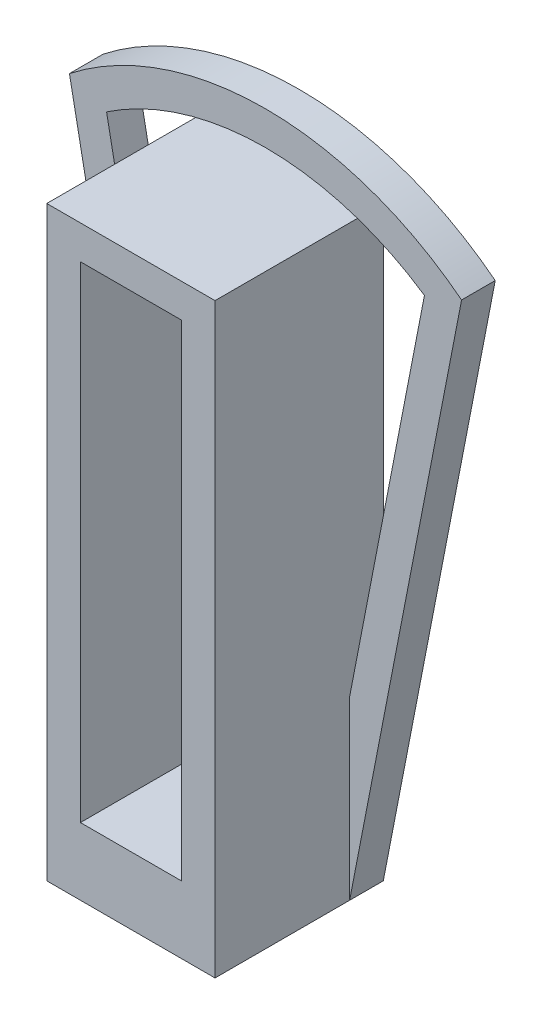
ISO-10303-21;
HEADER;
FILE_DESCRIPTION(('STEP AP214'),'2;1');
FILE_NAME('part.step','',(''),(''),'','','');
FILE_SCHEMA(('AUTOMOTIVE_DESIGN { 1 0 10303 214 1 1 1 1 }'));
ENDSEC;
DATA;
#1=APPLICATION_CONTEXT('core data for automotive mechanical design processes');
#2=APPLICATION_PROTOCOL_DEFINITION('international standard','automotive_design',2000,#1);
#3=PRODUCT_CONTEXT('',#1,'mechanical');
#4=PRODUCT('Part','Part','',(#3));
#5=PRODUCT_RELATED_PRODUCT_CATEGORY('part','',(#4));
#6=PRODUCT_DEFINITION_FORMATION('','',#4);
#7=PRODUCT_DEFINITION_CONTEXT('part definition',#1,'design');
#8=PRODUCT_DEFINITION('design','',#6,#7);
#9=PRODUCT_DEFINITION_SHAPE('','',#8);
#10=(LENGTH_UNIT() NAMED_UNIT(*) SI_UNIT(.MILLI.,.METRE.));
#11=(NAMED_UNIT(*) PLANE_ANGLE_UNIT() SI_UNIT($,.RADIAN.));
#12=(NAMED_UNIT(*) SI_UNIT($,.STERADIAN.) SOLID_ANGLE_UNIT());
#13=UNCERTAINTY_MEASURE_WITH_UNIT(LENGTH_MEASURE(1.E-05),#10,'distance_accuracy_value','');
#14=(GEOMETRIC_REPRESENTATION_CONTEXT(3) GLOBAL_UNCERTAINTY_ASSIGNED_CONTEXT((#13)) GLOBAL_UNIT_ASSIGNED_CONTEXT((#10,
#11,#12)) REPRESENTATION_CONTEXT('',''));
#15=CARTESIAN_POINT('',(0.,0.,0.));
#16=DIRECTION('',(0.,0.,1.));
#17=DIRECTION('',(1.,0.,0.));
#18=AXIS2_PLACEMENT_3D('',#15,#16,#17);
#19=CARTESIAN_POINT('',(0.,0.,1.));
#20=DIRECTION('',(0.,0.,-1.));
#21=DIRECTION('',(-1.,0.,0.));
#22=AXIS2_PLACEMENT_3D('',#19,#20,#21);
#23=PLANE('',#22);
#24=DIRECTION('',(0.,-1.,0.));
#25=VECTOR('',#24,1.);
#26=CARTESIAN_POINT('',(-0.5,-1.7,1.));
#27=LINE('',#26,#25);
#28=CARTESIAN_POINT('',(-0.5,1.78641679103579,1.));
#29=VERTEX_POINT('',#28);
#30=CARTESIAN_POINT('',(-0.5,-1.7,1.));
#31=VERTEX_POINT('',#30);
#32=EDGE_CURVE('E165',#29,#31,#27,.T.);
#33=ORIENTED_EDGE('',*,*,#32,.T.);
#34=DIRECTION('',(1.,0.,0.));
#35=VECTOR('',#34,1.);
#36=CARTESIAN_POINT('',(-0.5,-1.7,1.));
#37=LINE('',#36,#35);
#38=CARTESIAN_POINT('',(0.5,-1.7,1.));
#39=VERTEX_POINT('',#38);
#40=EDGE_CURVE('E169',#31,#39,#37,.T.);
#41=ORIENTED_EDGE('',*,*,#40,.T.);
#42=DIRECTION('',(0.,1.,0.));
#43=VECTOR('',#42,1.);
#44=CARTESIAN_POINT('',(0.5,-1.7,1.));
#45=LINE('',#44,#43);
#46=CARTESIAN_POINT('',(0.5,1.78641679103579,1.));
#47=VERTEX_POINT('',#46);
#48=EDGE_CURVE('E173',#39,#47,#45,.T.);
#49=ORIENTED_EDGE('',*,*,#48,.T.);
#50=DIRECTION('',(-1.,0.,0.));
#51=VECTOR('',#50,1.);
#52=CARTESIAN_POINT('',(-0.5,1.78641679103579,1.));
#53=LINE('',#52,#51);
#54=EDGE_CURVE('E176',#47,#29,#53,.T.);
#55=ORIENTED_EDGE('',*,*,#54,.T.);
#56=EDGE_LOOP('',(#33,#41,#49,#55));
#57=FACE_BOUND('',#56,.T.);
#58=DIRECTION('',(0.,-1.,0.));
#59=VECTOR('',#58,1.);
#60=CARTESIAN_POINT('',(-0.3,1.58641679103579,1.));
#61=LINE('',#60,#59);
#62=CARTESIAN_POINT('',(-0.3,1.58641679103579,1.));
#63=VERTEX_POINT('',#62);
#64=CARTESIAN_POINT('',(-0.3,-1.3,1.));
#65=VERTEX_POINT('',#64);
#66=EDGE_CURVE('E117',#63,#65,#61,.T.);
#67=ORIENTED_EDGE('',*,*,#66,.F.);
#68=DIRECTION('',(-1.,0.,0.));
#69=VECTOR('',#68,1.);
#70=CARTESIAN_POINT('',(-0.3,1.58641679103579,1.));
#71=LINE('',#70,#69);
#72=CARTESIAN_POINT('',(0.3,1.58641679103579,1.));
#73=VERTEX_POINT('',#72);
#74=EDGE_CURVE('E143',#73,#63,#71,.T.);
#75=ORIENTED_EDGE('',*,*,#74,.F.);
#76=DIRECTION('',(0.,1.,0.));
#77=VECTOR('',#76,1.);
#78=CARTESIAN_POINT('',(0.3,1.58641679103579,1.));
#79=LINE('',#78,#77);
#80=CARTESIAN_POINT('',(0.3,-1.3,1.));
#81=VERTEX_POINT('',#80);
#82=EDGE_CURVE('E139',#81,#73,#79,.T.);
#83=ORIENTED_EDGE('',*,*,#82,.F.);
#84=DIRECTION('',(1.,0.,0.));
#85=VECTOR('',#84,1.);
#86=CARTESIAN_POINT('',(-0.3,-1.3,1.));
#87=LINE('',#86,#85);
#88=EDGE_CURVE('E126',#65,#81,#87,.T.);
#89=ORIENTED_EDGE('',*,*,#88,.F.);
#90=EDGE_LOOP('',(#67,#75,#83,#89));
#91=FACE_BOUND('',#90,.T.);
#92=ADVANCED_FACE('F51',(#57,#91),#23,.F.);
#93=CARTESIAN_POINT('',(0.,0.,0.));
#94=DIRECTION('',(0.,0.,-1.));
#95=DIRECTION('',(-1.,0.,0.));
#96=AXIS2_PLACEMENT_3D('',#93,#94,#95);
#97=PLANE('',#96);
#98=DIRECTION('',(0.,-1.,0.));
#99=VECTOR('',#98,1.);
#100=CARTESIAN_POINT('',(-0.5,-1.7,0.));
#101=LINE('',#100,#99);
#102=CARTESIAN_POINT('',(-0.5,1.78641679103579,0.));
#103=VERTEX_POINT('',#102);
#104=CARTESIAN_POINT('',(-0.5,-1.7,0.));
#105=VERTEX_POINT('',#104);
#106=EDGE_CURVE('E135',#103,#105,#101,.T.);
#107=ORIENTED_EDGE('',*,*,#106,.F.);
#108=DIRECTION('',(-1.,0.,0.));
#109=VECTOR('',#108,1.);
#110=CARTESIAN_POINT('',(-0.5,1.78641679103579,0.));
#111=LINE('',#110,#109);
#112=CARTESIAN_POINT('',(0.5,1.78641679103579,0.));
#113=VERTEX_POINT('',#112);
#114=EDGE_CURVE('E170',#113,#103,#111,.T.);
#115=ORIENTED_EDGE('',*,*,#114,.F.);
#116=DIRECTION('',(0.,1.,0.));
#117=VECTOR('',#116,1.);
#118=CARTESIAN_POINT('',(0.5,-1.7,0.));
#119=LINE('',#118,#117);
#120=CARTESIAN_POINT('',(0.5,-1.7,0.));
#121=VERTEX_POINT('',#120);
#122=EDGE_CURVE('E186',#121,#113,#119,.T.);
#123=ORIENTED_EDGE('',*,*,#122,.F.);
#124=DIRECTION('',(1.,0.,0.));
#125=VECTOR('',#124,1.);
#126=CARTESIAN_POINT('',(-0.5,-1.7,0.));
#127=LINE('',#126,#125);
#128=EDGE_CURVE('E183',#105,#121,#127,.T.);
#129=ORIENTED_EDGE('',*,*,#128,.F.);
#130=EDGE_LOOP('',(#107,#115,#123,#129));
#131=FACE_BOUND('',#130,.T.);
#132=DIRECTION('',(-1.,0.,0.));
#133=VECTOR('',#132,1.);
#134=CARTESIAN_POINT('',(-0.3,1.58641679103579,0.));
#135=LINE('',#134,#133);
#136=CARTESIAN_POINT('',(0.3,1.58641679103579,0.));
#137=VERTEX_POINT('',#136);
#138=CARTESIAN_POINT('',(-0.3,1.58641679103579,0.));
#139=VERTEX_POINT('',#138);
#140=EDGE_CURVE('E127',#137,#139,#135,.T.);
#141=ORIENTED_EDGE('',*,*,#140,.T.);
#142=DIRECTION('',(0.,-1.,0.));
#143=VECTOR('',#142,1.);
#144=CARTESIAN_POINT('',(-0.3,1.58641679103579,0.));
#145=LINE('',#144,#143);
#146=CARTESIAN_POINT('',(-0.3,-1.3,0.));
#147=VERTEX_POINT('',#146);
#148=EDGE_CURVE('E75',#139,#147,#145,.T.);
#149=ORIENTED_EDGE('',*,*,#148,.T.);
#150=DIRECTION('',(1.,0.,0.));
#151=VECTOR('',#150,1.);
#152=CARTESIAN_POINT('',(-0.3,-1.3,0.));
#153=LINE('',#152,#151);
#154=CARTESIAN_POINT('',(0.3,-1.3,0.));
#155=VERTEX_POINT('',#154);
#156=EDGE_CURVE('E133',#147,#155,#153,.T.);
#157=ORIENTED_EDGE('',*,*,#156,.T.);
#158=DIRECTION('',(0.,1.,0.));
#159=VECTOR('',#158,1.);
#160=CARTESIAN_POINT('',(0.3,1.58641679103579,0.));
#161=LINE('',#160,#159);
#162=EDGE_CURVE('E152',#155,#137,#161,.T.);
#163=ORIENTED_EDGE('',*,*,#162,.T.);
#164=EDGE_LOOP('',(#141,#149,#157,#163));
#165=FACE_BOUND('',#164,.T.);
#166=ADVANCED_FACE('F209',(#131,#165),#97,.T.);
#167=CARTESIAN_POINT('',(-0.5,-1.7,1.));
#168=DIRECTION('',(1.,0.,0.));
#169=DIRECTION('',(0.,0.,-1.));
#170=AXIS2_PLACEMENT_3D('',#167,#168,#169);
#171=PLANE('',#170);
#172=ORIENTED_EDGE('',*,*,#106,.T.);
#173=DIRECTION('',(0.,0.,-1.));
#174=VECTOR('',#173,1.);
#175=CARTESIAN_POINT('',(-0.5,-1.7,1.));
#176=LINE('',#175,#174);
#177=EDGE_CURVE('E12',#31,#105,#176,.T.);
#178=ORIENTED_EDGE('',*,*,#177,.F.);
#179=ORIENTED_EDGE('',*,*,#32,.F.);
#180=DIRECTION('',(0.,0.,-1.));
#181=VECTOR('',#180,1.);
#182=CARTESIAN_POINT('',(-0.5,1.78641679103579,1.));
#183=LINE('',#182,#181);
#184=EDGE_CURVE('E179',#29,#103,#183,.T.);
#185=ORIENTED_EDGE('',*,*,#184,.T.);
#186=EDGE_LOOP('',(#172,#178,#179,#185));
#187=FACE_BOUND('',#186,.T.);
#188=ADVANCED_FACE('F53',(#187),#171,.F.);
#189=CARTESIAN_POINT('',(-0.5,-1.7,1.));
#190=DIRECTION('',(0.,1.,0.));
#191=DIRECTION('',(0.,0.,1.));
#192=AXIS2_PLACEMENT_3D('',#189,#190,#191);
#193=PLANE('',#192);
#194=ORIENTED_EDGE('',*,*,#128,.T.);
#195=DIRECTION('',(0.,0.,-1.));
#196=VECTOR('',#195,1.);
#197=CARTESIAN_POINT('',(0.5,-1.7,1.));
#198=LINE('',#197,#196);
#199=EDGE_CURVE('E60',#39,#121,#198,.T.);
#200=ORIENTED_EDGE('',*,*,#199,.F.);
#201=ORIENTED_EDGE('',*,*,#40,.F.);
#202=ORIENTED_EDGE('',*,*,#177,.T.);
#203=EDGE_LOOP('',(#194,#200,#201,#202));
#204=FACE_BOUND('',#203,.T.);
#205=ADVANCED_FACE('F219',(#204),#193,.F.);
#206=CARTESIAN_POINT('',(0.5,-1.7,1.));
#207=DIRECTION('',(-1.,0.,0.));
#208=DIRECTION('',(0.,0.,1.));
#209=AXIS2_PLACEMENT_3D('',#206,#207,#208);
#210=PLANE('',#209);
#211=ORIENTED_EDGE('',*,*,#122,.T.);
#212=DIRECTION('',(0.,0.,-1.));
#213=VECTOR('',#212,1.);
#214=CARTESIAN_POINT('',(0.5,1.78641679103579,1.));
#215=LINE('',#214,#213);
#216=EDGE_CURVE('E194',#47,#113,#215,.T.);
#217=ORIENTED_EDGE('',*,*,#216,.F.);
#218=ORIENTED_EDGE('',*,*,#48,.F.);
#219=ORIENTED_EDGE('',*,*,#199,.T.);
#220=EDGE_LOOP('',(#211,#217,#218,#219));
#221=FACE_BOUND('',#220,.T.);
#222=ADVANCED_FACE('F203',(#221),#210,.F.);
#223=CARTESIAN_POINT('',(-0.5,1.78641679103579,1.));
#224=DIRECTION('',(0.,-1.,0.));
#225=DIRECTION('',(0.,0.,-1.));
#226=AXIS2_PLACEMENT_3D('',#223,#224,#225);
#227=PLANE('',#226);
#228=ORIENTED_EDGE('',*,*,#114,.T.);
#229=ORIENTED_EDGE('',*,*,#184,.F.);
#230=ORIENTED_EDGE('',*,*,#54,.F.);
#231=ORIENTED_EDGE('',*,*,#216,.T.);
#232=EDGE_LOOP('',(#228,#229,#230,#231));
#233=FACE_BOUND('',#232,.T.);
#234=ADVANCED_FACE('F213',(#233),#227,.F.);
#235=CARTESIAN_POINT('',(-0.3,1.58641679103579,1.));
#236=DIRECTION('',(1.,0.,0.));
#237=DIRECTION('',(0.,1.,0.));
#238=AXIS2_PLACEMENT_3D('',#235,#236,#237);
#239=PLANE('',#238);
#240=ORIENTED_EDGE('',*,*,#148,.F.);
#241=DIRECTION('',(0.,0.,-1.));
#242=VECTOR('',#241,1.);
#243=CARTESIAN_POINT('',(-0.3,1.58641679103579,1.));
#244=LINE('',#243,#242);
#245=EDGE_CURVE('E121',#63,#139,#244,.T.);
#246=ORIENTED_EDGE('',*,*,#245,.F.);
#247=ORIENTED_EDGE('',*,*,#66,.T.);
#248=DIRECTION('',(0.,0.,-1.));
#249=VECTOR('',#248,1.);
#250=CARTESIAN_POINT('',(-0.3,-1.3,1.));
#251=LINE('',#250,#249);
#252=EDGE_CURVE('E120',#65,#147,#251,.T.);
#253=ORIENTED_EDGE('',*,*,#252,.T.);
#254=EDGE_LOOP('',(#240,#246,#247,#253));
#255=FACE_BOUND('',#254,.T.);
#256=ADVANCED_FACE('F119',(#255),#239,.T.);
#257=CARTESIAN_POINT('',(-0.3,-1.3,1.));
#258=DIRECTION('',(0.,1.,0.));
#259=DIRECTION('',(0.,0.,1.));
#260=AXIS2_PLACEMENT_3D('',#257,#258,#259);
#261=PLANE('',#260);
#262=ORIENTED_EDGE('',*,*,#156,.F.);
#263=ORIENTED_EDGE('',*,*,#252,.F.);
#264=ORIENTED_EDGE('',*,*,#88,.T.);
#265=DIRECTION('',(0.,0.,-1.));
#266=VECTOR('',#265,1.);
#267=CARTESIAN_POINT('',(0.3,-1.3,1.));
#268=LINE('',#267,#266);
#269=EDGE_CURVE('E136',#81,#155,#268,.T.);
#270=ORIENTED_EDGE('',*,*,#269,.T.);
#271=EDGE_LOOP('',(#262,#263,#264,#270));
#272=FACE_BOUND('',#271,.T.);
#273=ADVANCED_FACE('F130',(#272),#261,.T.);
#274=CARTESIAN_POINT('',(0.3,1.58641679103579,1.));
#275=DIRECTION('',(-1.,0.,0.));
#276=DIRECTION('',(0.,-1.,0.));
#277=AXIS2_PLACEMENT_3D('',#274,#275,#276);
#278=PLANE('',#277);
#279=ORIENTED_EDGE('',*,*,#162,.F.);
#280=ORIENTED_EDGE('',*,*,#269,.F.);
#281=ORIENTED_EDGE('',*,*,#82,.T.);
#282=DIRECTION('',(0.,0.,-1.));
#283=VECTOR('',#282,1.);
#284=CARTESIAN_POINT('',(0.3,1.58641679103579,1.));
#285=LINE('',#284,#283);
#286=EDGE_CURVE('E67',#73,#137,#285,.T.);
#287=ORIENTED_EDGE('',*,*,#286,.T.);
#288=EDGE_LOOP('',(#279,#280,#281,#287));
#289=FACE_BOUND('',#288,.T.);
#290=ADVANCED_FACE('F242',(#289),#278,.T.);
#291=CARTESIAN_POINT('',(-0.3,1.58641679103579,1.));
#292=DIRECTION('',(0.,-1.,0.));
#293=DIRECTION('',(0.,0.,-1.));
#294=AXIS2_PLACEMENT_3D('',#291,#292,#293);
#295=PLANE('',#294);
#296=ORIENTED_EDGE('',*,*,#140,.F.);
#297=ORIENTED_EDGE('',*,*,#286,.F.);
#298=ORIENTED_EDGE('',*,*,#74,.T.);
#299=ORIENTED_EDGE('',*,*,#245,.T.);
#300=EDGE_LOOP('',(#296,#297,#298,#299));
#301=FACE_BOUND('',#300,.T.);
#302=ADVANCED_FACE('F246',(#301),#295,.T.);
#303=CLOSED_SHELL('',(#92,#166,#188,#205,#222,#234,#256,#273,#290,#302));
#304=MANIFOLD_SOLID_BREP('B2',#303);
#305=CARTESIAN_POINT('',(0.,0.232796998725857,0.2));
#306=DIRECTION('',(0.,0.,-1.));
#307=DIRECTION('',(-1.,0.,0.));
#308=AXIS2_PLACEMENT_3D('',#305,#306,#307);
#309=PLANE('',#308);
#310=DIRECTION('',(0.190808995376545,0.981627183447664,0.));
#311=VECTOR('',#310,1.);
#312=CARTESIAN_POINT('',(0.335132722836501,-1.5,0.2));
#313=LINE('',#312,#311);
#314=CARTESIAN_POINT('',(0.374008784664045,-1.3,0.2));
#315=VERTEX_POINT('',#314);
#316=CARTESIAN_POINT('',(0.944627099087957,1.63557674105574,0.2));
#317=VERTEX_POINT('',#316);
#318=EDGE_CURVE('E388',#315,#317,#313,.T.);
#319=ORIENTED_EDGE('',*,*,#318,.F.);
#320=DIRECTION('',(-1.,0.,0.));
#321=VECTOR('',#320,1.);
#322=CARTESIAN_POINT('',(-0.374008784664045,-1.3,0.2));
#323=LINE('',#322,#321);
#324=CARTESIAN_POINT('',(-0.374008784664045,-1.3,0.2));
#325=VERTEX_POINT('',#324);
#326=EDGE_CURVE('E384',#315,#325,#323,.T.);
#327=ORIENTED_EDGE('',*,*,#326,.T.);
#328=DIRECTION('',(0.190808995376546,-0.981627183447664,0.));
#329=VECTOR('',#328,1.);
#330=CARTESIAN_POINT('',(-0.335132722836501,-1.5,0.2));
#331=LINE('',#330,#329);
#332=CARTESIAN_POINT('',(-0.944627099087958,1.63557674105574,0.2));
#333=VERTEX_POINT('',#332);
#334=EDGE_CURVE('E367',#333,#325,#331,.T.);
#335=ORIENTED_EDGE('',*,*,#334,.F.);
#336=CARTESIAN_POINT('',(0.,0.232796998725857,0.2));
#337=DIRECTION('',(0.,0.,1.));
#338=DIRECTION('',(-1.,0.,0.));
#339=AXIS2_PLACEMENT_3D('',#336,#337,#338);
#340=CIRCLE('',#339,1.6911863770213);
#341=EDGE_CURVE('E378',#317,#333,#340,.T.);
#342=ORIENTED_EDGE('',*,*,#341,.F.);
#343=EDGE_LOOP('',(#319,#327,#335,#342));
#344=FACE_BOUND('',#343,.T.);
#345=DIRECTION('',(1.,0.,0.));
#346=VECTOR('',#345,1.);
#347=CARTESIAN_POINT('',(-0.5,-1.7,0.2));
#348=LINE('',#347,#346);
#349=CARTESIAN_POINT('',(-0.5,-1.7,0.2));
#350=VERTEX_POINT('',#349);
#351=CARTESIAN_POINT('',(0.5,-1.7,0.2));
#352=VERTEX_POINT('',#351);
#353=EDGE_CURVE('E405',#350,#352,#348,.T.);
#354=ORIENTED_EDGE('',*,*,#353,.T.);
#355=DIRECTION('',(0.190808995376545,0.981627183447664,0.));
#356=VECTOR('',#355,1.);
#357=CARTESIAN_POINT('',(0.5,-1.7,0.2));
#358=LINE('',#357,#356);
#359=CARTESIAN_POINT('',(1.16523968536146,1.72236149490911,0.2));
#360=VERTEX_POINT('',#359);
#361=EDGE_CURVE('E408',#352,#360,#358,.T.);
#362=ORIENTED_EDGE('',*,*,#361,.T.);
#363=CARTESIAN_POINT('',(0.,0.232796998725857,0.2));
#364=DIRECTION('',(0.,0.,1.));
#365=DIRECTION('',(-1.,0.,0.));
#366=AXIS2_PLACEMENT_3D('',#363,#364,#365);
#367=CIRCLE('',#366,1.8911863770213);
#368=CARTESIAN_POINT('',(-1.16523968536146,1.72236149490911,0.2));
#369=VERTEX_POINT('',#368);
#370=EDGE_CURVE('E411',#360,#369,#367,.T.);
#371=ORIENTED_EDGE('',*,*,#370,.T.);
#372=DIRECTION('',(0.190808995376545,-0.981627183447664,0.));
#373=VECTOR('',#372,1.);
#374=CARTESIAN_POINT('',(-0.5,-1.7,0.2));
#375=LINE('',#374,#373);
#376=EDGE_CURVE('E413',#369,#350,#375,.T.);
#377=ORIENTED_EDGE('',*,*,#376,.T.);
#378=EDGE_LOOP('',(#354,#362,#371,#377));
#379=FACE_BOUND('',#378,.T.);
#380=ADVANCED_FACE('F304',(#344,#379),#309,.F.);
#381=CARTESIAN_POINT('',(0.,0.232796998725857,0.));
#382=DIRECTION('',(0.,0.,-1.));
#383=DIRECTION('',(-1.,0.,0.));
#384=AXIS2_PLACEMENT_3D('',#381,#382,#383);
#385=PLANE('',#384);
#386=DIRECTION('',(-1.,0.,0.));
#387=VECTOR('',#386,1.);
#388=CARTESIAN_POINT('',(-0.374008784664045,-1.3,0.));
#389=LINE('',#388,#387);
#390=CARTESIAN_POINT('',(0.374008784664045,-1.3,0.));
#391=VERTEX_POINT('',#390);
#392=CARTESIAN_POINT('',(-0.374008784664045,-1.3,0.));
#393=VERTEX_POINT('',#392);
#394=EDGE_CURVE('E385',#391,#393,#389,.T.);
#395=ORIENTED_EDGE('',*,*,#394,.F.);
#396=DIRECTION('',(0.190808995376545,0.981627183447664,0.));
#397=VECTOR('',#396,1.);
#398=CARTESIAN_POINT('',(0.335132722836501,-1.5,0.));
#399=LINE('',#398,#397);
#400=CARTESIAN_POINT('',(0.944627099087957,1.63557674105574,0.));
#401=VERTEX_POINT('',#400);
#402=EDGE_CURVE('E324',#391,#401,#399,.T.);
#403=ORIENTED_EDGE('',*,*,#402,.T.);
#404=CARTESIAN_POINT('',(0.,0.232796998725857,0.));
#405=DIRECTION('',(0.,0.,1.));
#406=DIRECTION('',(-1.,0.,0.));
#407=AXIS2_PLACEMENT_3D('',#404,#405,#406);
#408=CIRCLE('',#407,1.6911863770213);
#409=CARTESIAN_POINT('',(-0.944627099087958,1.63557674105574,0.));
#410=VERTEX_POINT('',#409);
#411=EDGE_CURVE('E397',#401,#410,#408,.T.);
#412=ORIENTED_EDGE('',*,*,#411,.T.);
#413=DIRECTION('',(0.190808995376546,-0.981627183447664,0.));
#414=VECTOR('',#413,1.);
#415=CARTESIAN_POINT('',(-0.335132722836501,-1.5,0.));
#416=LINE('',#415,#414);
#417=EDGE_CURVE('E394',#410,#393,#416,.T.);
#418=ORIENTED_EDGE('',*,*,#417,.T.);
#419=EDGE_LOOP('',(#395,#403,#412,#418));
#420=FACE_BOUND('',#419,.T.);
#421=DIRECTION('',(1.,0.,0.));
#422=VECTOR('',#421,1.);
#423=CARTESIAN_POINT('',(-0.5,-1.7,0.));
#424=LINE('',#423,#422);
#425=CARTESIAN_POINT('',(-0.5,-1.7,0.));
#426=VERTEX_POINT('',#425);
#427=CARTESIAN_POINT('',(0.5,-1.7,0.));
#428=VERTEX_POINT('',#427);
#429=EDGE_CURVE('E404',#426,#428,#424,.T.);
#430=ORIENTED_EDGE('',*,*,#429,.F.);
#431=DIRECTION('',(0.190808995376545,-0.981627183447664,0.));
#432=VECTOR('',#431,1.);
#433=CARTESIAN_POINT('',(-0.5,-1.7,0.));
#434=LINE('',#433,#432);
#435=CARTESIAN_POINT('',(-1.16523968536146,1.72236149490911,0.));
#436=VERTEX_POINT('',#435);
#437=EDGE_CURVE('E409',#436,#426,#434,.T.);
#438=ORIENTED_EDGE('',*,*,#437,.F.);
#439=CARTESIAN_POINT('',(0.,0.232796998725857,0.));
#440=DIRECTION('',(0.,0.,1.));
#441=DIRECTION('',(-1.,0.,0.));
#442=AXIS2_PLACEMENT_3D('',#439,#440,#441);
#443=CIRCLE('',#442,1.8911863770213);
#444=CARTESIAN_POINT('',(1.16523968536146,1.72236149490911,0.));
#445=VERTEX_POINT('',#444);
#446=EDGE_CURVE('E420',#445,#436,#443,.T.);
#447=ORIENTED_EDGE('',*,*,#446,.F.);
#448=DIRECTION('',(0.190808995376545,0.981627183447664,0.));
#449=VECTOR('',#448,1.);
#450=CARTESIAN_POINT('',(0.5,-1.7,0.));
#451=LINE('',#450,#449);
#452=EDGE_CURVE('E418',#428,#445,#451,.T.);
#453=ORIENTED_EDGE('',*,*,#452,.F.);
#454=EDGE_LOOP('',(#430,#438,#447,#453));
#455=FACE_BOUND('',#454,.T.);
#456=ADVANCED_FACE('F438',(#420,#455),#385,.T.);
#457=CARTESIAN_POINT('',(-0.5,-1.7,0.2));
#458=DIRECTION('',(0.,1.,0.));
#459=DIRECTION('',(0.,0.,1.));
#460=AXIS2_PLACEMENT_3D('',#457,#458,#459);
#461=PLANE('',#460);
#462=ORIENTED_EDGE('',*,*,#429,.T.);
#463=DIRECTION('',(0.,0.,-1.));
#464=VECTOR('',#463,1.);
#465=CARTESIAN_POINT('',(0.5,-1.7,0.2));
#466=LINE('',#465,#464);
#467=EDGE_CURVE('E49',#352,#428,#466,.T.);
#468=ORIENTED_EDGE('',*,*,#467,.F.);
#469=ORIENTED_EDGE('',*,*,#353,.F.);
#470=DIRECTION('',(0.,0.,-1.));
#471=VECTOR('',#470,1.);
#472=CARTESIAN_POINT('',(-0.5,-1.7,0.2));
#473=LINE('',#472,#471);
#474=EDGE_CURVE('E415',#350,#426,#473,.T.);
#475=ORIENTED_EDGE('',*,*,#474,.T.);
#476=EDGE_LOOP('',(#462,#468,#469,#475));
#477=FACE_BOUND('',#476,.T.);
#478=ADVANCED_FACE('F306',(#477),#461,.F.);
#479=CARTESIAN_POINT('',(0.5,-1.7,0.2));
#480=DIRECTION('',(-0.981627183447664,0.190808995376545,0.));
#481=DIRECTION('',(-0.190808995376545,-0.981627183447664,0.));
#482=AXIS2_PLACEMENT_3D('',#479,#480,#481);
#483=PLANE('',#482);
#484=ORIENTED_EDGE('',*,*,#452,.T.);
#485=DIRECTION('',(0.,0.,-1.));
#486=VECTOR('',#485,1.);
#487=CARTESIAN_POINT('',(1.16523968536146,1.72236149490911,0.2));
#488=LINE('',#487,#486);
#489=EDGE_CURVE('E312',#360,#445,#488,.T.);
#490=ORIENTED_EDGE('',*,*,#489,.F.);
#491=ORIENTED_EDGE('',*,*,#361,.F.);
#492=ORIENTED_EDGE('',*,*,#467,.T.);
#493=EDGE_LOOP('',(#484,#490,#491,#492));
#494=FACE_BOUND('',#493,.T.);
#495=ADVANCED_FACE('F446',(#494),#483,.F.);
#496=CARTESIAN_POINT('',(0.,0.232796998725857,0.2));
#497=DIRECTION('',(0.,0.,-1.));
#498=DIRECTION('',(-1.,0.,0.));
#499=AXIS2_PLACEMENT_3D('',#496,#497,#498);
#500=CYLINDRICAL_SURFACE('',#499,1.8911863770213);
#501=ORIENTED_EDGE('',*,*,#446,.T.);
#502=DIRECTION('',(0.,0.,-1.));
#503=VECTOR('',#502,1.);
#504=CARTESIAN_POINT('',(-1.16523968536146,1.72236149490911,0.2));
#505=LINE('',#504,#503);
#506=EDGE_CURVE('E425',#369,#436,#505,.T.);
#507=ORIENTED_EDGE('',*,*,#506,.F.);
#508=ORIENTED_EDGE('',*,*,#370,.F.);
#509=ORIENTED_EDGE('',*,*,#489,.T.);
#510=EDGE_LOOP('',(#501,#507,#508,#509));
#511=FACE_BOUND('',#510,.T.);
#512=ADVANCED_FACE('F432',(#511),#500,.T.);
#513=CARTESIAN_POINT('',(-0.5,-1.7,0.2));
#514=DIRECTION('',(0.981627183447664,0.190808995376545,0.));
#515=DIRECTION('',(-0.190808995376546,0.981627183447664,0.));
#516=AXIS2_PLACEMENT_3D('',#513,#514,#515);
#517=PLANE('',#516);
#518=ORIENTED_EDGE('',*,*,#437,.T.);
#519=ORIENTED_EDGE('',*,*,#474,.F.);
#520=ORIENTED_EDGE('',*,*,#376,.F.);
#521=ORIENTED_EDGE('',*,*,#506,.T.);
#522=EDGE_LOOP('',(#518,#519,#520,#521));
#523=FACE_BOUND('',#522,.T.);
#524=ADVANCED_FACE('F441',(#523),#517,.F.);
#525=CARTESIAN_POINT('',(0.335132722836501,-1.5,0.2));
#526=DIRECTION('',(-0.981627183447664,0.190808995376545,0.));
#527=DIRECTION('',(-0.190808995376545,-0.981627183447664,0.));
#528=AXIS2_PLACEMENT_3D('',#525,#526,#527);
#529=PLANE('',#528);
#530=DIRECTION('',(0.,0.,1.));
#531=VECTOR('',#530,1.);
#532=CARTESIAN_POINT('',(0.374008784664045,-1.3,-0.774293409518319));
#533=LINE('',#532,#531);
#534=EDGE_CURVE('E319',#391,#315,#533,.T.);
#535=ORIENTED_EDGE('',*,*,#534,.T.);
#536=ORIENTED_EDGE('',*,*,#318,.T.);
#537=DIRECTION('',(0.,0.,-1.));
#538=VECTOR('',#537,1.);
#539=CARTESIAN_POINT('',(0.944627099087957,1.63557674105574,0.2));
#540=LINE('',#539,#538);
#541=EDGE_CURVE('E402',#317,#401,#540,.T.);
#542=ORIENTED_EDGE('',*,*,#541,.T.);
#543=ORIENTED_EDGE('',*,*,#402,.F.);
#544=EDGE_LOOP('',(#535,#536,#542,#543));
#545=FACE_BOUND('',#544,.T.);
#546=ADVANCED_FACE('F461',(#545),#529,.T.);
#547=CARTESIAN_POINT('',(0.,0.232796998725857,0.2));
#548=DIRECTION('',(0.,0.,-1.));
#549=DIRECTION('',(-1.,0.,0.));
#550=AXIS2_PLACEMENT_3D('',#547,#548,#549);
#551=CYLINDRICAL_SURFACE('',#550,1.6911863770213);
#552=ORIENTED_EDGE('',*,*,#411,.F.);
#553=ORIENTED_EDGE('',*,*,#541,.F.);
#554=ORIENTED_EDGE('',*,*,#341,.T.);
#555=DIRECTION('',(0.,0.,-1.));
#556=VECTOR('',#555,1.);
#557=CARTESIAN_POINT('',(-0.944627099087958,1.63557674105574,0.2));
#558=LINE('',#557,#556);
#559=EDGE_CURVE('E373',#333,#410,#558,.T.);
#560=ORIENTED_EDGE('',*,*,#559,.T.);
#561=EDGE_LOOP('',(#552,#553,#554,#560));
#562=FACE_BOUND('',#561,.T.);
#563=ADVANCED_FACE('F468',(#562),#551,.F.);
#564=CARTESIAN_POINT('',(-0.335132722836501,-1.5,0.2));
#565=DIRECTION('',(0.981627183447664,0.190808995376546,0.));
#566=DIRECTION('',(-0.190808995376546,0.981627183447664,0.));
#567=AXIS2_PLACEMENT_3D('',#564,#565,#566);
#568=PLANE('',#567);
#569=DIRECTION('',(0.,0.,1.));
#570=VECTOR('',#569,1.);
#571=CARTESIAN_POINT('',(-0.374008784664045,-1.3,-0.774293409518319));
#572=LINE('',#571,#570);
#573=EDGE_CURVE('E371',#393,#325,#572,.T.);
#574=ORIENTED_EDGE('',*,*,#573,.F.);
#575=ORIENTED_EDGE('',*,*,#417,.F.);
#576=ORIENTED_EDGE('',*,*,#559,.F.);
#577=ORIENTED_EDGE('',*,*,#334,.T.);
#578=EDGE_LOOP('',(#574,#575,#576,#577));
#579=FACE_BOUND('',#578,.T.);
#580=ADVANCED_FACE('F369',(#579),#568,.T.);
#581=CARTESIAN_POINT('',(-0.374008784664045,-1.3,-0.774293409518319));
#582=DIRECTION('',(0.,1.,0.));
#583=DIRECTION('',(-1.,0.,0.));
#584=AXIS2_PLACEMENT_3D('',#581,#582,#583);
#585=PLANE('',#584);
#586=ORIENTED_EDGE('',*,*,#534,.F.);
#587=ORIENTED_EDGE('',*,*,#394,.T.);
#588=ORIENTED_EDGE('',*,*,#573,.T.);
#589=ORIENTED_EDGE('',*,*,#326,.F.);
#590=EDGE_LOOP('',(#586,#587,#588,#589));
#591=FACE_BOUND('',#590,.T.);
#592=ADVANCED_FACE('F383',(#591),#585,.T.);
#593=CLOSED_SHELL('',(#380,#456,#478,#495,#512,#524,#546,#563,#580,#592));
#594=MANIFOLD_SOLID_BREP('B6_NOT_SHOWN',#593);
#595=ADVANCED_BREP_SHAPE_REPRESENTATION('',(#18,#304,#594),#14);
#596=SHAPE_DEFINITION_REPRESENTATION(#9,#595);
ENDSEC;
END-ISO-10303-21;
